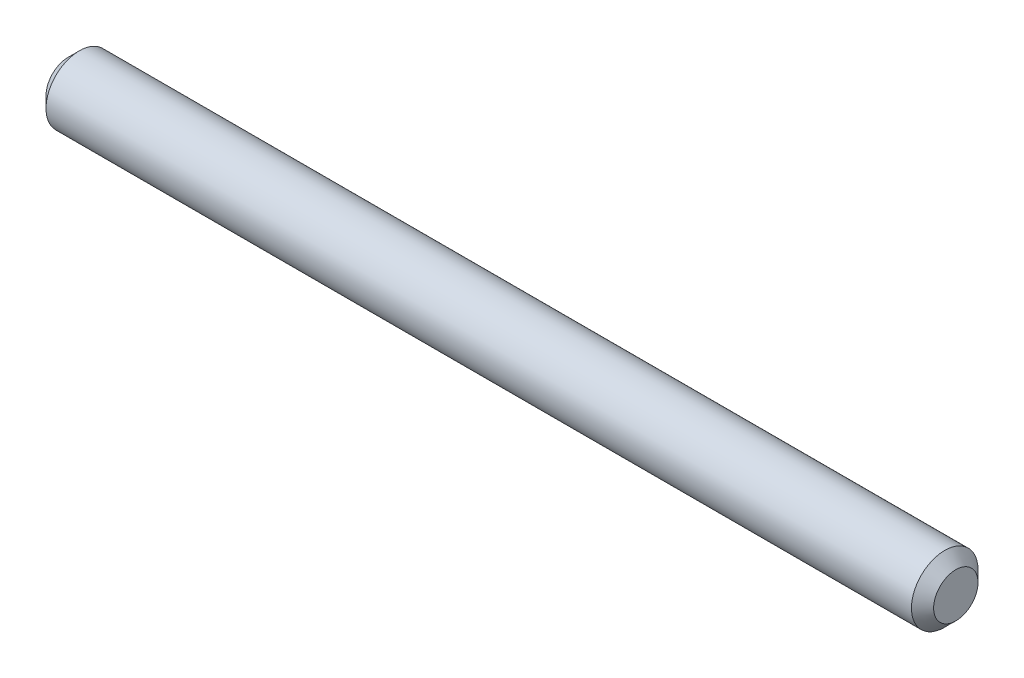
ISO-10303-21;
HEADER;
FILE_DESCRIPTION(('STEP AP214'),'2;1');
FILE_NAME('part.step','',(''),(''),'','','');
FILE_SCHEMA(('AUTOMOTIVE_DESIGN { 1 0 10303 214 1 1 1 1 }'));
ENDSEC;
DATA;
#1=APPLICATION_CONTEXT('core data for automotive mechanical design processes');
#2=APPLICATION_PROTOCOL_DEFINITION('international standard','automotive_design',2000,#1);
#3=PRODUCT_CONTEXT('',#1,'mechanical');
#4=PRODUCT('Part','Part','',(#3));
#5=PRODUCT_RELATED_PRODUCT_CATEGORY('part','',(#4));
#6=PRODUCT_DEFINITION_FORMATION('','',#4);
#7=PRODUCT_DEFINITION_CONTEXT('part definition',#1,'design');
#8=PRODUCT_DEFINITION('design','',#6,#7);
#9=PRODUCT_DEFINITION_SHAPE('','',#8);
#10=(LENGTH_UNIT() NAMED_UNIT(*) SI_UNIT(.MILLI.,.METRE.));
#11=(NAMED_UNIT(*) PLANE_ANGLE_UNIT() SI_UNIT($,.RADIAN.));
#12=(NAMED_UNIT(*) SI_UNIT($,.STERADIAN.) SOLID_ANGLE_UNIT());
#13=UNCERTAINTY_MEASURE_WITH_UNIT(LENGTH_MEASURE(1.E-05),#10,'distance_accuracy_value','');
#14=(GEOMETRIC_REPRESENTATION_CONTEXT(3) GLOBAL_UNCERTAINTY_ASSIGNED_CONTEXT((#13)) GLOBAL_UNIT_ASSIGNED_CONTEXT((#10,
#11,#12)) REPRESENTATION_CONTEXT('',''));
#15=CARTESIAN_POINT('',(0.,0.,0.));
#16=DIRECTION('',(0.,0.,1.));
#17=DIRECTION('',(1.,0.,0.));
#18=AXIS2_PLACEMENT_3D('',#15,#16,#17);
#19=CARTESIAN_POINT('',(40.,0.,0.));
#20=DIRECTION('',(-1.,0.,0.));
#21=DIRECTION('',(0.,0.,1.));
#22=AXIS2_PLACEMENT_3D('',#19,#20,#21);
#23=CYLINDRICAL_SURFACE('',#22,3.);
#24=CARTESIAN_POINT('',(-39.,0.,0.));
#25=DIRECTION('',(1.,0.,0.));
#26=DIRECTION('',(0.,0.,-1.));
#27=AXIS2_PLACEMENT_3D('',#24,#25,#26);
#28=CIRCLE('',#27,3.);
#29=CARTESIAN_POINT('',(-39.,0.,-3.));
#30=VERTEX_POINT('',#29);
#31=EDGE_CURVE('E42',#30,#30,#28,.T.);
#32=ORIENTED_EDGE('',*,*,#31,.T.);
#33=EDGE_LOOP('',(#32));
#34=FACE_BOUND('',#33,.T.);
#35=CARTESIAN_POINT('',(39.,0.,0.));
#36=DIRECTION('',(1.,0.,0.));
#37=DIRECTION('',(0.,0.,-1.));
#38=AXIS2_PLACEMENT_3D('',#35,#36,#37);
#39=CIRCLE('',#38,3.);
#40=CARTESIAN_POINT('',(39.,0.,-3.));
#41=VERTEX_POINT('',#40);
#42=EDGE_CURVE('E46',#41,#41,#39,.F.);
#43=ORIENTED_EDGE('',*,*,#42,.T.);
#44=EDGE_LOOP('',(#43));
#45=FACE_BOUND('',#44,.T.);
#46=ADVANCED_FACE('F31',(#34,#45),#23,.T.);
#47=CARTESIAN_POINT('',(40.,0.,0.));
#48=DIRECTION('',(1.,0.,0.));
#49=DIRECTION('',(0.,0.,-1.));
#50=AXIS2_PLACEMENT_3D('',#47,#48,#49);
#51=PLANE('',#50);
#52=CARTESIAN_POINT('',(40.,0.,0.));
#53=DIRECTION('',(1.,0.,0.));
#54=DIRECTION('',(0.,0.,-1.));
#55=AXIS2_PLACEMENT_3D('',#52,#53,#54);
#56=CIRCLE('',#55,1.99999999999999);
#57=CARTESIAN_POINT('',(40.,0.,-1.99999999999999));
#58=VERTEX_POINT('',#57);
#59=EDGE_CURVE('E10',#58,#58,#56,.T.);
#60=ORIENTED_EDGE('',*,*,#59,.T.);
#61=EDGE_LOOP('',(#60));
#62=FACE_BOUND('',#61,.T.);
#63=ADVANCED_FACE('F62',(#62),#51,.T.);
#64=CARTESIAN_POINT('',(-40.,0.,0.));
#65=DIRECTION('',(1.,0.,0.));
#66=DIRECTION('',(0.,0.,-1.));
#67=AXIS2_PLACEMENT_3D('',#64,#65,#66);
#68=PLANE('',#67);
#69=CARTESIAN_POINT('',(-40.,0.,0.));
#70=DIRECTION('',(1.,0.,0.));
#71=DIRECTION('',(0.,0.,-1.));
#72=AXIS2_PLACEMENT_3D('',#69,#70,#71);
#73=CIRCLE('',#72,2.);
#74=CARTESIAN_POINT('',(-40.,0.,-2.));
#75=VERTEX_POINT('',#74);
#76=EDGE_CURVE('E38',#75,#75,#73,.F.);
#77=ORIENTED_EDGE('',*,*,#76,.T.);
#78=EDGE_LOOP('',(#77));
#79=FACE_BOUND('',#78,.T.);
#80=ADVANCED_FACE('F59',(#79),#68,.F.);
#81=CARTESIAN_POINT('',(-39.,0.,0.));
#82=DIRECTION('',(1.,0.,0.));
#83=DIRECTION('',(0.,0.,-1.));
#84=AXIS2_PLACEMENT_3D('',#81,#82,#83);
#85=CONICAL_SURFACE('',#84,3.,0.785398163397454);
#86=ORIENTED_EDGE('',*,*,#76,.F.);
#87=EDGE_LOOP('',(#86));
#88=FACE_BOUND('',#87,.T.);
#89=ORIENTED_EDGE('',*,*,#31,.F.);
#90=EDGE_LOOP('',(#89));
#91=FACE_BOUND('',#90,.T.);
#92=ADVANCED_FACE('F55',(#88,#91),#85,.T.);
#93=CARTESIAN_POINT('',(40.,0.,0.));
#94=DIRECTION('',(-1.,0.,0.));
#95=DIRECTION('',(0.,0.,1.));
#96=AXIS2_PLACEMENT_3D('',#93,#94,#95);
#97=CONICAL_SURFACE('',#96,1.99999999999999,0.785398163397447);
#98=ORIENTED_EDGE('',*,*,#42,.F.);
#99=EDGE_LOOP('',(#98));
#100=FACE_BOUND('',#99,.T.);
#101=ORIENTED_EDGE('',*,*,#59,.F.);
#102=EDGE_LOOP('',(#101));
#103=FACE_BOUND('',#102,.T.);
#104=ADVANCED_FACE('F33',(#100,#103),#97,.T.);
#105=CLOSED_SHELL('',(#46,#63,#80,#92,#104));
#106=MANIFOLD_SOLID_BREP('B2',#105);
#107=ADVANCED_BREP_SHAPE_REPRESENTATION('',(#18,#106),#14);
#108=SHAPE_DEFINITION_REPRESENTATION(#9,#107);
ENDSEC;
END-ISO-10303-21;
